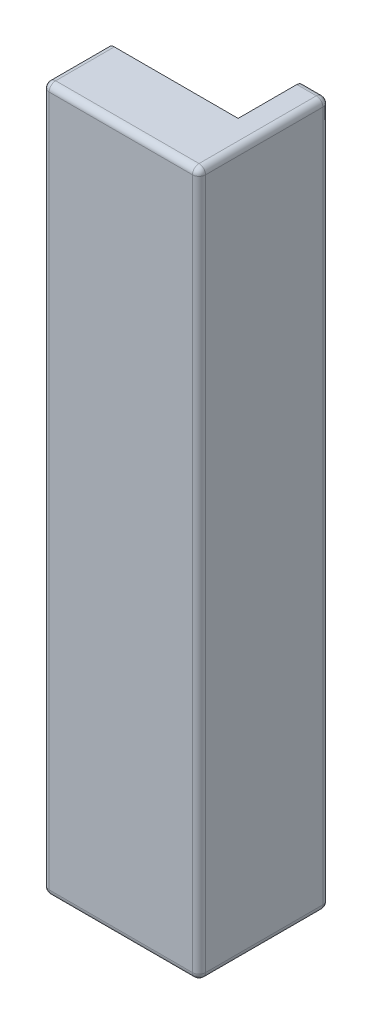
ISO-10303-21;
HEADER;
FILE_DESCRIPTION(('STEP AP214'),'2;1');
FILE_NAME('part.step','',(''),(''),'','','');
FILE_SCHEMA(('AUTOMOTIVE_DESIGN { 1 0 10303 214 1 1 1 1 }'));
ENDSEC;
DATA;
#1=APPLICATION_CONTEXT('core data for automotive mechanical design processes');
#2=APPLICATION_PROTOCOL_DEFINITION('international standard','automotive_design',2000,#1);
#3=PRODUCT_CONTEXT('',#1,'mechanical');
#4=PRODUCT('Part','Part','',(#3));
#5=PRODUCT_RELATED_PRODUCT_CATEGORY('part','',(#4));
#6=PRODUCT_DEFINITION_FORMATION('','',#4);
#7=PRODUCT_DEFINITION_CONTEXT('part definition',#1,'design');
#8=PRODUCT_DEFINITION('design','',#6,#7);
#9=PRODUCT_DEFINITION_SHAPE('','',#8);
#10=(LENGTH_UNIT() NAMED_UNIT(*) SI_UNIT(.MILLI.,.METRE.));
#11=(NAMED_UNIT(*) PLANE_ANGLE_UNIT() SI_UNIT($,.RADIAN.));
#12=(NAMED_UNIT(*) SI_UNIT($,.STERADIAN.) SOLID_ANGLE_UNIT());
#13=UNCERTAINTY_MEASURE_WITH_UNIT(LENGTH_MEASURE(1.E-05),#10,'distance_accuracy_value','');
#14=(GEOMETRIC_REPRESENTATION_CONTEXT(3) GLOBAL_UNCERTAINTY_ASSIGNED_CONTEXT((#13)) GLOBAL_UNIT_ASSIGNED_CONTEXT((#10,
#11,#12)) REPRESENTATION_CONTEXT('',''));
#15=CARTESIAN_POINT('',(0.,0.,0.));
#16=DIRECTION('',(0.,0.,1.));
#17=DIRECTION('',(1.,0.,0.));
#18=AXIS2_PLACEMENT_3D('',#15,#16,#17);
#19=CARTESIAN_POINT('',(-30.8979043428297,-33.1465425171613,10.));
#20=DIRECTION('',(0.,1.,0.));
#21=DIRECTION('',(0.,0.,1.));
#22=AXIS2_PLACEMENT_3D('',#19,#20,#21);
#23=PLANE('',#22);
#24=DIRECTION('',(1.,0.,0.));
#25=VECTOR('',#24,1.);
#26=CARTESIAN_POINT('',(-30.8979043428297,-33.1465425171613,9.5));
#27=LINE('',#26,#25);
#28=CARTESIAN_POINT('',(-19.3979043428297,-33.1465425171613,9.5));
#29=VERTEX_POINT('',#28);
#30=CARTESIAN_POINT('',(-30.3979043428297,-33.1465425171613,9.5));
#31=VERTEX_POINT('',#30);
#32=EDGE_CURVE('E281',#29,#31,#27,.F.);
#33=ORIENTED_EDGE('',*,*,#32,.T.);
#34=DIRECTION('',(0.,0.,-1.));
#35=VECTOR('',#34,1.);
#36=CARTESIAN_POINT('',(-30.3979043428297,-33.1465425171613,10.));
#37=LINE('',#36,#35);
#38=CARTESIAN_POINT('',(-30.3979043428297,-33.1465425171613,5.00000000000001));
#39=VERTEX_POINT('',#38);
#40=EDGE_CURVE('E285',#31,#39,#37,.T.);
#41=ORIENTED_EDGE('',*,*,#40,.T.);
#42=DIRECTION('',(1.,0.,0.));
#43=VECTOR('',#42,1.);
#44=CARTESIAN_POINT('',(-30.8979043428297,-33.1465425171613,5.00000000000001));
#45=LINE('',#44,#43);
#46=CARTESIAN_POINT('',(-20.8979043428297,-33.1465425171613,5.00000000000001));
#47=VERTEX_POINT('',#46);
#48=EDGE_CURVE('E242',#39,#47,#45,.T.);
#49=ORIENTED_EDGE('',*,*,#48,.T.);
#50=DIRECTION('',(0.,0.,-1.));
#51=VECTOR('',#50,1.);
#52=CARTESIAN_POINT('',(-20.8979043428297,-33.1465425171613,10.));
#53=LINE('',#52,#51);
#54=CARTESIAN_POINT('',(-20.8979043428297,-33.1465425171613,0.5));
#55=VERTEX_POINT('',#54);
#56=EDGE_CURVE('E244',#47,#55,#53,.T.);
#57=ORIENTED_EDGE('',*,*,#56,.T.);
#58=DIRECTION('',(1.,0.,0.));
#59=VECTOR('',#58,1.);
#60=CARTESIAN_POINT('',(-18.8979043428297,-33.1465425171613,0.5));
#61=LINE('',#60,#59);
#62=CARTESIAN_POINT('',(-19.3979043428297,-33.1465425171613,0.5));
#63=VERTEX_POINT('',#62);
#64=EDGE_CURVE('E283',#55,#63,#61,.T.);
#65=ORIENTED_EDGE('',*,*,#64,.T.);
#66=DIRECTION('',(0.,0.,-1.));
#67=VECTOR('',#66,1.);
#68=CARTESIAN_POINT('',(-19.3979043428297,-33.1465425171613,10.));
#69=LINE('',#68,#67);
#70=EDGE_CURVE('E279',#63,#29,#69,.F.);
#71=ORIENTED_EDGE('',*,*,#70,.T.);
#72=EDGE_LOOP('',(#33,#41,#49,#57,#65,#71));
#73=FACE_BOUND('',#72,.T.);
#74=ADVANCED_FACE('F43',(#73),#23,.F.);
#75=CARTESIAN_POINT('',(-18.8979043428297,20.8534574828387,10.));
#76=DIRECTION('',(1.,0.,0.));
#77=DIRECTION('',(0.,1.,0.));
#78=AXIS2_PLACEMENT_3D('',#75,#76,#77);
#79=PLANE('',#78);
#80=DIRECTION('',(0.,0.,-1.));
#81=VECTOR('',#80,1.);
#82=CARTESIAN_POINT('',(-18.8979043428297,-32.6465425171613,0.));
#83=LINE('',#82,#81);
#84=CARTESIAN_POINT('',(-18.8979043428297,-32.6465425171613,9.5));
#85=VERTEX_POINT('',#84);
#86=CARTESIAN_POINT('',(-18.8979043428297,-32.6465425171613,0.5));
#87=VERTEX_POINT('',#86);
#88=EDGE_CURVE('E338',#85,#87,#83,.T.);
#89=ORIENTED_EDGE('',*,*,#88,.T.);
#90=DIRECTION('',(0.,-1.,0.));
#91=VECTOR('',#90,1.);
#92=CARTESIAN_POINT('',(-18.8979043428297,20.8534574828387,0.5));
#93=LINE('',#92,#91);
#94=CARTESIAN_POINT('',(-18.8979043428297,20.3534574828387,0.5));
#95=VERTEX_POINT('',#94);
#96=EDGE_CURVE('E341',#87,#95,#93,.F.);
#97=ORIENTED_EDGE('',*,*,#96,.T.);
#98=DIRECTION('',(0.,0.,-1.));
#99=VECTOR('',#98,1.);
#100=CARTESIAN_POINT('',(-18.8979043428297,20.3534574828387,10.));
#101=LINE('',#100,#99);
#102=CARTESIAN_POINT('',(-18.8979043428297,20.3534574828387,9.5));
#103=VERTEX_POINT('',#102);
#104=EDGE_CURVE('E68',#95,#103,#101,.F.);
#105=ORIENTED_EDGE('',*,*,#104,.T.);
#106=DIRECTION('',(0.,-1.,0.));
#107=VECTOR('',#106,1.);
#108=CARTESIAN_POINT('',(-18.8979043428297,-33.1465425171613,9.5));
#109=LINE('',#108,#107);
#110=EDGE_CURVE('E336',#103,#85,#109,.T.);
#111=ORIENTED_EDGE('',*,*,#110,.T.);
#112=EDGE_LOOP('',(#89,#97,#105,#111));
#113=FACE_BOUND('',#112,.T.);
#114=ADVANCED_FACE('F512',(#113),#79,.T.);
#115=CARTESIAN_POINT('',(-30.8979043428297,20.8534574828387,10.));
#116=DIRECTION('',(0.,1.,0.));
#117=DIRECTION('',(0.,0.,1.));
#118=AXIS2_PLACEMENT_3D('',#115,#116,#117);
#119=PLANE('',#118);
#120=DIRECTION('',(1.,0.,0.));
#121=VECTOR('',#120,1.);
#122=CARTESIAN_POINT('',(-30.8979043428297,20.8534574828387,5.));
#123=LINE('',#122,#121);
#124=CARTESIAN_POINT('',(-30.3979043428297,20.8534574828387,5.));
#125=VERTEX_POINT('',#124);
#126=CARTESIAN_POINT('',(-20.8979043428297,20.8534574828387,5.));
#127=VERTEX_POINT('',#126);
#128=EDGE_CURVE('E228',#125,#127,#123,.T.);
#129=ORIENTED_EDGE('',*,*,#128,.F.);
#130=DIRECTION('',(0.,0.,-1.));
#131=VECTOR('',#130,1.);
#132=CARTESIAN_POINT('',(-30.3979043428297,20.8534574828387,10.));
#133=LINE('',#132,#131);
#134=CARTESIAN_POINT('',(-30.3979043428297,20.8534574828387,9.5));
#135=VERTEX_POINT('',#134);
#136=EDGE_CURVE('E314',#125,#135,#133,.F.);
#137=ORIENTED_EDGE('',*,*,#136,.T.);
#138=DIRECTION('',(1.,0.,0.));
#139=VECTOR('',#138,1.);
#140=CARTESIAN_POINT('',(-18.8979043428297,20.8534574828387,9.5));
#141=LINE('',#140,#139);
#142=CARTESIAN_POINT('',(-19.3979043428297,20.8534574828387,9.5));
#143=VERTEX_POINT('',#142);
#144=EDGE_CURVE('E310',#135,#143,#141,.T.);
#145=ORIENTED_EDGE('',*,*,#144,.T.);
#146=DIRECTION('',(0.,0.,-1.));
#147=VECTOR('',#146,1.);
#148=CARTESIAN_POINT('',(-19.3979043428297,20.8534574828387,10.));
#149=LINE('',#148,#147);
#150=CARTESIAN_POINT('',(-19.3979043428297,20.8534574828387,0.5));
#151=VERTEX_POINT('',#150);
#152=EDGE_CURVE('E308',#143,#151,#149,.T.);
#153=ORIENTED_EDGE('',*,*,#152,.T.);
#154=DIRECTION('',(1.,0.,0.));
#155=VECTOR('',#154,1.);
#156=CARTESIAN_POINT('',(-30.8979043428297,20.8534574828387,0.5));
#157=LINE('',#156,#155);
#158=CARTESIAN_POINT('',(-20.8979043428297,20.8534574828387,0.5));
#159=VERTEX_POINT('',#158);
#160=EDGE_CURVE('E312',#151,#159,#157,.F.);
#161=ORIENTED_EDGE('',*,*,#160,.T.);
#162=DIRECTION('',(0.,0.,-1.));
#163=VECTOR('',#162,1.);
#164=CARTESIAN_POINT('',(-20.8979043428297,20.8534574828387,10.));
#165=LINE('',#164,#163);
#166=EDGE_CURVE('E247',#127,#159,#165,.T.);
#167=ORIENTED_EDGE('',*,*,#166,.F.);
#168=EDGE_LOOP('',(#129,#137,#145,#153,#161,#167));
#169=FACE_BOUND('',#168,.T.);
#170=ADVANCED_FACE('F499',(#169),#119,.T.);
#171=CARTESIAN_POINT('',(-30.8979043428297,20.8534574828387,10.));
#172=DIRECTION('',(1.,0.,0.));
#173=DIRECTION('',(0.,1.,0.));
#174=AXIS2_PLACEMENT_3D('',#171,#172,#173);
#175=PLANE('',#174);
#176=DIRECTION('',(0.,1.,0.));
#177=VECTOR('',#176,1.);
#178=CARTESIAN_POINT('',(-30.8979043428297,20.8534574828387,8.5));
#179=LINE('',#178,#177);
#180=CARTESIAN_POINT('',(-30.8979043428297,19.3534574828387,8.5));
#181=VERTEX_POINT('',#180);
#182=CARTESIAN_POINT('',(-30.8979043428297,-31.6465425171613,8.50000000000001));
#183=VERTEX_POINT('',#182);
#184=EDGE_CURVE('E269',#181,#183,#179,.F.);
#185=ORIENTED_EDGE('',*,*,#184,.T.);
#186=DIRECTION('',(0.,0.,1.));
#187=VECTOR('',#186,1.);
#188=CARTESIAN_POINT('',(-30.8979043428297,-31.6465425171613,10.));
#189=LINE('',#188,#187);
#190=CARTESIAN_POINT('',(-30.8979043428297,-31.6465425171613,5.00000000000001));
#191=VERTEX_POINT('',#190);
#192=EDGE_CURVE('E273',#183,#191,#189,.F.);
#193=ORIENTED_EDGE('',*,*,#192,.T.);
#194=DIRECTION('',(0.,1.,0.));
#195=VECTOR('',#194,1.);
#196=CARTESIAN_POINT('',(-30.8979043428297,23.1695625144717,5.));
#197=LINE('',#196,#195);
#198=CARTESIAN_POINT('',(-30.8979043428297,-32.6465425171613,5.00000000000001));
#199=VERTEX_POINT('',#198);
#200=EDGE_CURVE('E234',#199,#191,#197,.T.);
#201=ORIENTED_EDGE('',*,*,#200,.F.);
#202=DIRECTION('',(0.,0.,-1.));
#203=VECTOR('',#202,1.);
#204=CARTESIAN_POINT('',(-30.8979043428297,-32.6465425171613,10.));
#205=LINE('',#204,#203);
#206=CARTESIAN_POINT('',(-30.8979043428297,-32.6465425171613,9.5));
#207=VERTEX_POINT('',#206);
#208=EDGE_CURVE('E267',#199,#207,#205,.F.);
#209=ORIENTED_EDGE('',*,*,#208,.T.);
#210=DIRECTION('',(0.,-1.,0.));
#211=VECTOR('',#210,1.);
#212=CARTESIAN_POINT('',(-30.8979043428297,20.8534574828387,9.5));
#213=LINE('',#212,#211);
#214=CARTESIAN_POINT('',(-30.8979043428297,20.3534574828387,9.5));
#215=VERTEX_POINT('',#214);
#216=EDGE_CURVE('E265',#207,#215,#213,.F.);
#217=ORIENTED_EDGE('',*,*,#216,.T.);
#218=DIRECTION('',(0.,0.,-1.));
#219=VECTOR('',#218,1.);
#220=CARTESIAN_POINT('',(-30.8979043428297,20.3534574828387,5.));
#221=LINE('',#220,#219);
#222=CARTESIAN_POINT('',(-30.8979043428297,20.3534574828387,5.));
#223=VERTEX_POINT('',#222);
#224=EDGE_CURVE('E263',#215,#223,#221,.T.);
#225=ORIENTED_EDGE('',*,*,#224,.T.);
#226=CARTESIAN_POINT('',(-30.8979043428297,19.3534574828387,5.));
#227=VERTEX_POINT('',#226);
#228=EDGE_CURVE('E237',#227,#223,#197,.T.);
#229=ORIENTED_EDGE('',*,*,#228,.F.);
#230=DIRECTION('',(0.,0.,-1.));
#231=VECTOR('',#230,1.);
#232=CARTESIAN_POINT('',(-30.8979043428297,19.3534574828387,10.));
#233=LINE('',#232,#231);
#234=EDGE_CURVE('E271',#227,#181,#233,.F.);
#235=ORIENTED_EDGE('',*,*,#234,.T.);
#236=EDGE_LOOP('',(#185,#193,#201,#209,#217,#225,#229,#235));
#237=FACE_BOUND('',#236,.T.);
#238=ADVANCED_FACE('F454',(#237),#175,.F.);
#239=CARTESIAN_POINT('',(0.,0.,10.));
#240=DIRECTION('',(0.,0.,-1.));
#241=DIRECTION('',(-1.,0.,0.));
#242=AXIS2_PLACEMENT_3D('',#239,#240,#241);
#243=PLANE('',#242);
#244=DIRECTION('',(1.,0.,0.));
#245=VECTOR('',#244,1.);
#246=CARTESIAN_POINT('',(-30.8979043428297,20.3534574828387,10.));
#247=LINE('',#246,#245);
#248=CARTESIAN_POINT('',(-19.3979043428297,20.3534574828387,10.));
#249=VERTEX_POINT('',#248);
#250=CARTESIAN_POINT('',(-30.3979043428297,20.3534574828387,10.));
#251=VERTEX_POINT('',#250);
#252=EDGE_CURVE('E303',#249,#251,#247,.F.);
#253=ORIENTED_EDGE('',*,*,#252,.T.);
#254=DIRECTION('',(0.,-1.,0.));
#255=VECTOR('',#254,1.);
#256=CARTESIAN_POINT('',(-30.3979043428297,0.,10.));
#257=LINE('',#256,#255);
#258=CARTESIAN_POINT('',(-30.3979043428297,-32.6465425171613,10.));
#259=VERTEX_POINT('',#258);
#260=EDGE_CURVE('E305',#251,#259,#257,.T.);
#261=ORIENTED_EDGE('',*,*,#260,.T.);
#262=DIRECTION('',(1.,0.,0.));
#263=VECTOR('',#262,1.);
#264=CARTESIAN_POINT('',(0.,-32.6465425171613,10.));
#265=LINE('',#264,#263);
#266=CARTESIAN_POINT('',(-19.3979043428297,-32.6465425171613,10.));
#267=VERTEX_POINT('',#266);
#268=EDGE_CURVE('E301',#259,#267,#265,.T.);
#269=ORIENTED_EDGE('',*,*,#268,.T.);
#270=DIRECTION('',(0.,-1.,0.));
#271=VECTOR('',#270,1.);
#272=CARTESIAN_POINT('',(-19.3979043428297,20.8534574828387,10.));
#273=LINE('',#272,#271);
#274=EDGE_CURVE('E299',#267,#249,#273,.F.);
#275=ORIENTED_EDGE('',*,*,#274,.T.);
#276=EDGE_LOOP('',(#253,#261,#269,#275));
#277=FACE_BOUND('',#276,.T.);
#278=ADVANCED_FACE('F800',(#277),#243,.F.);
#279=CARTESIAN_POINT('',(0.,0.,0.));
#280=DIRECTION('',(0.,0.,-1.));
#281=DIRECTION('',(-1.,0.,0.));
#282=AXIS2_PLACEMENT_3D('',#279,#280,#281);
#283=PLANE('',#282);
#284=DIRECTION('',(0.,-1.,0.));
#285=VECTOR('',#284,1.);
#286=CARTESIAN_POINT('',(-20.8979043428297,18.8534574828387,0.));
#287=LINE('',#286,#285);
#288=CARTESIAN_POINT('',(-20.8979043428297,20.3534574828387,0.));
#289=VERTEX_POINT('',#288);
#290=CARTESIAN_POINT('',(-20.8979043428297,-32.6465425171613,0.));
#291=VERTEX_POINT('',#290);
#292=EDGE_CURVE('E249',#289,#291,#287,.T.);
#293=ORIENTED_EDGE('',*,*,#292,.F.);
#294=DIRECTION('',(1.,0.,0.));
#295=VECTOR('',#294,1.);
#296=CARTESIAN_POINT('',(0.,20.3534574828387,0.));
#297=LINE('',#296,#295);
#298=CARTESIAN_POINT('',(-19.3979043428297,20.3534574828387,0.));
#299=VERTEX_POINT('',#298);
#300=EDGE_CURVE('E334',#289,#299,#297,.T.);
#301=ORIENTED_EDGE('',*,*,#300,.T.);
#302=DIRECTION('',(0.,-1.,0.));
#303=VECTOR('',#302,1.);
#304=CARTESIAN_POINT('',(-19.3979043428297,0.,0.));
#305=LINE('',#304,#303);
#306=CARTESIAN_POINT('',(-19.3979043428297,-32.6465425171613,0.));
#307=VERTEX_POINT('',#306);
#308=EDGE_CURVE('E330',#299,#307,#305,.T.);
#309=ORIENTED_EDGE('',*,*,#308,.T.);
#310=DIRECTION('',(1.,0.,0.));
#311=VECTOR('',#310,1.);
#312=CARTESIAN_POINT('',(-20.8979043428297,-32.6465425171613,0.));
#313=LINE('',#312,#311);
#314=EDGE_CURVE('E332',#307,#291,#313,.F.);
#315=ORIENTED_EDGE('',*,*,#314,.T.);
#316=EDGE_LOOP('',(#293,#301,#309,#315));
#317=FACE_BOUND('',#316,.T.);
#318=ADVANCED_FACE('F536',(#317),#283,.T.);
#319=CARTESIAN_POINT('',(-20.8979043428297,18.8534574828387,0.));
#320=DIRECTION('',(0.,1.,0.));
#321=DIRECTION('',(0.,0.,1.));
#322=AXIS2_PLACEMENT_3D('',#319,#320,#321);
#323=PLANE('',#322);
#324=DIRECTION('',(-1.,0.,0.));
#325=VECTOR('',#324,1.);
#326=CARTESIAN_POINT('',(-20.8979043428297,18.8534574828387,8.));
#327=LINE('',#326,#325);
#328=CARTESIAN_POINT('',(-20.3979043428297,18.8534574828387,8.));
#329=VERTEX_POINT('',#328);
#330=CARTESIAN_POINT('',(-30.3979043428297,18.8534574828387,8.));
#331=VERTEX_POINT('',#330);
#332=EDGE_CURVE('E253',#329,#331,#327,.T.);
#333=ORIENTED_EDGE('',*,*,#332,.T.);
#334=DIRECTION('',(0.,0.,-1.));
#335=VECTOR('',#334,1.);
#336=CARTESIAN_POINT('',(-30.3979043428297,18.8534574828387,0.));
#337=LINE('',#336,#335);
#338=CARTESIAN_POINT('',(-30.3979043428297,18.8534574828387,5.));
#339=VERTEX_POINT('',#338);
#340=EDGE_CURVE('E225',#331,#339,#337,.T.);
#341=ORIENTED_EDGE('',*,*,#340,.T.);
#342=DIRECTION('',(1.,0.,0.));
#343=VECTOR('',#342,1.);
#344=CARTESIAN_POINT('',(-20.8979043428297,18.8534574828387,5.));
#345=LINE('',#344,#343);
#346=CARTESIAN_POINT('',(-20.8979043428297,18.8534574828387,5.));
#347=VERTEX_POINT('',#346);
#348=EDGE_CURVE('E221',#339,#347,#345,.T.);
#349=ORIENTED_EDGE('',*,*,#348,.T.);
#350=DIRECTION('',(0.,0.,1.));
#351=VECTOR('',#350,1.);
#352=CARTESIAN_POINT('',(-20.8979043428297,18.8534574828387,0.));
#353=LINE('',#352,#351);
#354=CARTESIAN_POINT('',(-20.8979043428297,18.8534574828387,4.5));
#355=VERTEX_POINT('',#354);
#356=EDGE_CURVE('E207',#355,#347,#353,.T.);
#357=ORIENTED_EDGE('',*,*,#356,.F.);
#358=CARTESIAN_POINT('',(-20.3979043428297,18.8534574828387,4.5));
#359=DIRECTION('',(0.,1.,0.));
#360=DIRECTION('',(0.,0.,1.));
#361=AXIS2_PLACEMENT_3D('',#358,#359,#360);
#362=CIRCLE('',#361,0.5);
#363=CARTESIAN_POINT('',(-20.3979043428297,18.8534574828387,5.));
#364=VERTEX_POINT('',#363);
#365=EDGE_CURVE('E11',#355,#364,#362,.T.);
#366=ORIENTED_EDGE('',*,*,#365,.T.);
#367=DIRECTION('',(0.,0.,-1.));
#368=VECTOR('',#367,1.);
#369=CARTESIAN_POINT('',(-20.3979043428297,18.8534574828387,8.));
#370=LINE('',#369,#368);
#371=EDGE_CURVE('E288',#364,#329,#370,.F.);
#372=ORIENTED_EDGE('',*,*,#371,.T.);
#373=EDGE_LOOP('',(#333,#341,#349,#357,#366,#372));
#374=FACE_BOUND('',#373,.T.);
#375=ADVANCED_FACE('F223',(#374),#323,.F.);
#376=CARTESIAN_POINT('',(-20.8979043428297,18.8534574828387,8.));
#377=DIRECTION('',(0.,0.,1.));
#378=DIRECTION('',(0.,-1.,0.));
#379=AXIS2_PLACEMENT_3D('',#376,#377,#378);
#380=PLANE('',#379);
#381=DIRECTION('',(-1.,0.,0.));
#382=VECTOR('',#381,1.);
#383=CARTESIAN_POINT('',(-20.8979043428297,-31.1465425171613,8.00000000000001));
#384=LINE('',#383,#382);
#385=CARTESIAN_POINT('',(-20.3979043428297,-31.1465425171613,8.00000000000001));
#386=VERTEX_POINT('',#385);
#387=CARTESIAN_POINT('',(-30.3979043428297,-31.1465425171613,8.00000000000001));
#388=VERTEX_POINT('',#387);
#389=EDGE_CURVE('E252',#386,#388,#384,.T.);
#390=ORIENTED_EDGE('',*,*,#389,.T.);
#391=DIRECTION('',(0.,1.,0.));
#392=VECTOR('',#391,1.);
#393=CARTESIAN_POINT('',(-30.3979043428297,18.8534574828387,8.));
#394=LINE('',#393,#392);
#395=EDGE_CURVE('E297',#388,#331,#394,.T.);
#396=ORIENTED_EDGE('',*,*,#395,.T.);
#397=ORIENTED_EDGE('',*,*,#332,.F.);
#398=DIRECTION('',(0.,1.,0.));
#399=VECTOR('',#398,1.);
#400=CARTESIAN_POINT('',(-20.3979043428297,-31.1465425171613,8.00000000000001));
#401=LINE('',#400,#399);
#402=EDGE_CURVE('E295',#329,#386,#401,.F.);
#403=ORIENTED_EDGE('',*,*,#402,.T.);
#404=EDGE_LOOP('',(#390,#396,#397,#403));
#405=FACE_BOUND('',#404,.T.);
#406=ADVANCED_FACE('F439',(#405),#380,.F.);
#407=CARTESIAN_POINT('',(-20.8979043428297,-31.1465425171613,0.));
#408=DIRECTION('',(0.,-1.,0.));
#409=DIRECTION('',(0.,0.,-1.));
#410=AXIS2_PLACEMENT_3D('',#407,#408,#409);
#411=PLANE('',#410);
#412=DIRECTION('',(-1.,0.,0.));
#413=VECTOR('',#412,1.);
#414=CARTESIAN_POINT('',(-20.8979043428297,-31.1465425171613,5.00000000000001));
#415=LINE('',#414,#413);
#416=CARTESIAN_POINT('',(-20.8979043428297,-31.1465425171613,5.));
#417=VERTEX_POINT('',#416);
#418=CARTESIAN_POINT('',(-30.3979043428297,-31.1465425171613,5.00000000000001));
#419=VERTEX_POINT('',#418);
#420=EDGE_CURVE('E229',#417,#419,#415,.T.);
#421=ORIENTED_EDGE('',*,*,#420,.T.);
#422=DIRECTION('',(0.,0.,1.));
#423=VECTOR('',#422,1.);
#424=CARTESIAN_POINT('',(-30.3979043428297,-31.1465425171613,0.));
#425=LINE('',#424,#423);
#426=EDGE_CURVE('E260',#419,#388,#425,.T.);
#427=ORIENTED_EDGE('',*,*,#426,.T.);
#428=ORIENTED_EDGE('',*,*,#389,.F.);
#429=DIRECTION('',(0.,0.,1.));
#430=VECTOR('',#429,1.);
#431=CARTESIAN_POINT('',(-20.3979043428297,-31.1465425171613,5.));
#432=LINE('',#431,#430);
#433=CARTESIAN_POINT('',(-20.3979043428297,-31.1465425171613,5.));
#434=VERTEX_POINT('',#433);
#435=EDGE_CURVE('E255',#386,#434,#432,.F.);
#436=ORIENTED_EDGE('',*,*,#435,.T.);
#437=CARTESIAN_POINT('',(-20.3979043428297,-31.1465425171613,4.5));
#438=DIRECTION('',(0.,-1.,0.));
#439=DIRECTION('',(0.,0.,-1.));
#440=AXIS2_PLACEMENT_3D('',#437,#438,#439);
#441=CIRCLE('',#440,0.5);
#442=CARTESIAN_POINT('',(-20.8979043428297,-31.1465425171613,4.5));
#443=VERTEX_POINT('',#442);
#444=EDGE_CURVE('E52',#434,#443,#441,.T.);
#445=ORIENTED_EDGE('',*,*,#444,.T.);
#446=DIRECTION('',(0.,0.,-1.));
#447=VECTOR('',#446,1.);
#448=CARTESIAN_POINT('',(-20.8979043428297,-31.1465425171613,0.));
#449=LINE('',#448,#447);
#450=EDGE_CURVE('E60',#417,#443,#449,.T.);
#451=ORIENTED_EDGE('',*,*,#450,.F.);
#452=EDGE_LOOP('',(#421,#427,#428,#436,#445,#451));
#453=FACE_BOUND('',#452,.T.);
#454=ADVANCED_FACE('F422',(#453),#411,.F.);
#455=CARTESIAN_POINT('',(-20.8979043428297,0.,0.));
#456=DIRECTION('',(-1.,0.,0.));
#457=DIRECTION('',(0.,0.,1.));
#458=AXIS2_PLACEMENT_3D('',#455,#456,#457);
#459=PLANE('',#458);
#460=DIRECTION('',(0.,1.,0.));
#461=VECTOR('',#460,1.);
#462=CARTESIAN_POINT('',(-20.8979043428297,23.1695625144717,5.));
#463=LINE('',#462,#461);
#464=EDGE_CURVE('E233',#47,#417,#463,.T.);
#465=ORIENTED_EDGE('',*,*,#464,.T.);
#466=ORIENTED_EDGE('',*,*,#450,.T.);
#467=DIRECTION('',(0.,-1.,0.));
#468=VECTOR('',#467,1.);
#469=CARTESIAN_POINT('',(-20.8979043428297,18.8534574828387,4.5));
#470=LINE('',#469,#468);
#471=EDGE_CURVE('E215',#443,#355,#470,.F.);
#472=ORIENTED_EDGE('',*,*,#471,.T.);
#473=ORIENTED_EDGE('',*,*,#356,.T.);
#474=EDGE_CURVE('E212',#347,#127,#463,.T.);
#475=ORIENTED_EDGE('',*,*,#474,.T.);
#476=ORIENTED_EDGE('',*,*,#166,.T.);
#477=CARTESIAN_POINT('',(-20.8979043428297,20.3534574828387,0.5));
#478=DIRECTION('',(-1.,0.,0.));
#479=DIRECTION('',(0.,0.,1.));
#480=AXIS2_PLACEMENT_3D('',#477,#478,#479);
#481=CIRCLE('',#480,0.5);
#482=EDGE_CURVE('E218',#159,#289,#481,.T.);
#483=ORIENTED_EDGE('',*,*,#482,.T.);
#484=ORIENTED_EDGE('',*,*,#292,.T.);
#485=CARTESIAN_POINT('',(-20.8979043428297,-32.6465425171613,0.5));
#486=DIRECTION('',(-1.,0.,0.));
#487=DIRECTION('',(0.,0.,1.));
#488=AXIS2_PLACEMENT_3D('',#485,#486,#487);
#489=CIRCLE('',#488,0.5);
#490=EDGE_CURVE('E325',#291,#55,#489,.T.);
#491=ORIENTED_EDGE('',*,*,#490,.T.);
#492=ORIENTED_EDGE('',*,*,#56,.F.);
#493=EDGE_LOOP('',(#465,#466,#472,#473,#475,#476,#483,#484,#491,#492));
#494=FACE_BOUND('',#493,.T.);
#495=ADVANCED_FACE('F209',(#494),#459,.T.);
#496=CARTESIAN_POINT('',(-20.8979043428297,23.1695625144717,5.));
#497=DIRECTION('',(0.,0.,1.));
#498=DIRECTION('',(0.,-1.,0.));
#499=AXIS2_PLACEMENT_3D('',#496,#497,#498);
#500=PLANE('',#499);
#501=ORIENTED_EDGE('',*,*,#200,.T.);
#502=CARTESIAN_POINT('',(-30.3979043428297,-31.6465425171613,5.00000000000001));
#503=DIRECTION('',(0.,0.,1.));
#504=DIRECTION('',(0.,-1.,0.));
#505=AXIS2_PLACEMENT_3D('',#502,#503,#504);
#506=CIRCLE('',#505,0.5);
#507=EDGE_CURVE('E277',#191,#419,#506,.F.);
#508=ORIENTED_EDGE('',*,*,#507,.T.);
#509=ORIENTED_EDGE('',*,*,#420,.F.);
#510=ORIENTED_EDGE('',*,*,#464,.F.);
#511=ORIENTED_EDGE('',*,*,#48,.F.);
#512=CARTESIAN_POINT('',(-30.3979043428297,-32.6465425171613,5.00000000000001));
#513=DIRECTION('',(0.,0.,1.));
#514=DIRECTION('',(0.,-1.,0.));
#515=AXIS2_PLACEMENT_3D('',#512,#513,#514);
#516=CIRCLE('',#515,0.5);
#517=EDGE_CURVE('E275',#39,#199,#516,.F.);
#518=ORIENTED_EDGE('',*,*,#517,.T.);
#519=EDGE_LOOP('',(#501,#508,#509,#510,#511,#518));
#520=FACE_BOUND('',#519,.T.);
#521=ADVANCED_FACE('F457',(#520),#500,.F.);
#522=ORIENTED_EDGE('',*,*,#348,.F.);
#523=CARTESIAN_POINT('',(-30.3979043428297,19.3534574828387,5.));
#524=DIRECTION('',(0.,0.,1.));
#525=DIRECTION('',(0.,-1.,0.));
#526=AXIS2_PLACEMENT_3D('',#523,#524,#525);
#527=CIRCLE('',#526,0.5);
#528=EDGE_CURVE('E293',#339,#227,#527,.F.);
#529=ORIENTED_EDGE('',*,*,#528,.T.);
#530=ORIENTED_EDGE('',*,*,#228,.T.);
#531=CARTESIAN_POINT('',(-30.3979043428297,20.3534574828387,5.));
#532=DIRECTION('',(0.,0.,1.));
#533=DIRECTION('',(0.,-1.,0.));
#534=AXIS2_PLACEMENT_3D('',#531,#532,#533);
#535=CIRCLE('',#534,0.5);
#536=EDGE_CURVE('E291',#223,#125,#535,.F.);
#537=ORIENTED_EDGE('',*,*,#536,.T.);
#538=ORIENTED_EDGE('',*,*,#128,.T.);
#539=ORIENTED_EDGE('',*,*,#474,.F.);
#540=EDGE_LOOP('',(#522,#529,#530,#537,#538,#539));
#541=FACE_BOUND('',#540,.T.);
#542=ADVANCED_FACE('F231',(#541),#500,.F.);
#543=CARTESIAN_POINT('',(-19.8979043428297,0.,0.));
#544=DIRECTION('',(1.,0.,0.));
#545=DIRECTION('',(0.,0.,-1.));
#546=AXIS2_PLACEMENT_3D('',#543,#544,#545);
#547=PLANE('',#546);
#548=DIRECTION('',(0.,0.,-1.));
#549=VECTOR('',#548,1.);
#550=CARTESIAN_POINT('',(-19.8979043428297,18.3534574828387,5.));
#551=LINE('',#550,#549);
#552=CARTESIAN_POINT('',(-19.8979043428297,18.3534574828387,7.5));
#553=VERTEX_POINT('',#552);
#554=CARTESIAN_POINT('',(-19.8979043428297,18.3534574828387,5.5));
#555=VERTEX_POINT('',#554);
#556=EDGE_CURVE('E318',#553,#555,#551,.T.);
#557=ORIENTED_EDGE('',*,*,#556,.T.);
#558=DIRECTION('',(0.,-1.,0.));
#559=VECTOR('',#558,1.);
#560=CARTESIAN_POINT('',(-19.8979043428297,-31.1465425171613,5.5));
#561=LINE('',#560,#559);
#562=CARTESIAN_POINT('',(-19.8979043428297,-30.6465425171613,5.5));
#563=VERTEX_POINT('',#562);
#564=EDGE_CURVE('E323',#555,#563,#561,.T.);
#565=ORIENTED_EDGE('',*,*,#564,.T.);
#566=DIRECTION('',(0.,0.,1.));
#567=VECTOR('',#566,1.);
#568=CARTESIAN_POINT('',(-19.8979043428297,-30.6465425171613,8.));
#569=LINE('',#568,#567);
#570=CARTESIAN_POINT('',(-19.8979043428297,-30.6465425171613,7.50000000000001));
#571=VERTEX_POINT('',#570);
#572=EDGE_CURVE('E320',#563,#571,#569,.T.);
#573=ORIENTED_EDGE('',*,*,#572,.T.);
#574=DIRECTION('',(0.,1.,0.));
#575=VECTOR('',#574,1.);
#576=CARTESIAN_POINT('',(-19.8979043428297,18.8534574828387,7.5));
#577=LINE('',#576,#575);
#578=EDGE_CURVE('E316',#571,#553,#577,.T.);
#579=ORIENTED_EDGE('',*,*,#578,.T.);
#580=EDGE_LOOP('',(#557,#565,#573,#579));
#581=FACE_BOUND('',#580,.T.);
#582=ADVANCED_FACE('F433',(#581),#547,.F.);
#583=CARTESIAN_POINT('',(-30.3979043428297,19.3534574828387,0.));
#584=DIRECTION('',(0.,0.,-1.));
#585=DIRECTION('',(-1.,0.,0.));
#586=AXIS2_PLACEMENT_3D('',#583,#584,#585);
#587=CYLINDRICAL_SURFACE('',#586,0.5);
#588=ORIENTED_EDGE('',*,*,#528,.F.);
#589=ORIENTED_EDGE('',*,*,#340,.F.);
#590=CARTESIAN_POINT('',(-30.3979043428297,19.3534574828387,8.5));
#591=DIRECTION('',(0.,0.707106781186547,-0.707106781186547));
#592=DIRECTION('',(0.,-0.707106781186548,-0.707106781186547));
#593=AXIS2_PLACEMENT_3D('',#590,#591,#592);
#594=ELLIPSE('',#593,0.707106781186547,0.5);
#595=EDGE_CURVE('E347',#181,#331,#594,.F.);
#596=ORIENTED_EDGE('',*,*,#595,.F.);
#597=ORIENTED_EDGE('',*,*,#234,.F.);
#598=EDGE_LOOP('',(#588,#589,#596,#597));
#599=FACE_BOUND('',#598,.T.);
#600=ADVANCED_FACE('F561',(#599),#587,.T.);
#601=CARTESIAN_POINT('',(-30.3979043428297,18.8534574828387,8.5));
#602=DIRECTION('',(0.,1.,0.));
#603=DIRECTION('',(-1.,0.,0.));
#604=AXIS2_PLACEMENT_3D('',#601,#602,#603);
#605=CYLINDRICAL_SURFACE('',#604,0.5);
#606=ORIENTED_EDGE('',*,*,#595,.T.);
#607=ORIENTED_EDGE('',*,*,#395,.F.);
#608=CARTESIAN_POINT('',(-30.3979043428297,-31.6465425171613,8.50000000000001));
#609=DIRECTION('',(0.,0.707106781186548,0.707106781186547));
#610=DIRECTION('',(0.,-0.707106781186547,0.707106781186547));
#611=AXIS2_PLACEMENT_3D('',#608,#609,#610);
#612=ELLIPSE('',#611,0.707106781186548,0.5);
#613=EDGE_CURVE('E345',#183,#388,#612,.F.);
#614=ORIENTED_EDGE('',*,*,#613,.F.);
#615=ORIENTED_EDGE('',*,*,#184,.F.);
#616=EDGE_LOOP('',(#606,#607,#614,#615));
#617=FACE_BOUND('',#616,.T.);
#618=ADVANCED_FACE('F443',(#617),#605,.T.);
#619=CARTESIAN_POINT('',(-30.3979043428297,-31.6465425171613,0.));
#620=DIRECTION('',(0.,0.,1.));
#621=DIRECTION('',(1.,0.,0.));
#622=AXIS2_PLACEMENT_3D('',#619,#620,#621);
#623=CYLINDRICAL_SURFACE('',#622,0.5);
#624=ORIENTED_EDGE('',*,*,#507,.F.);
#625=ORIENTED_EDGE('',*,*,#192,.F.);
#626=ORIENTED_EDGE('',*,*,#613,.T.);
#627=ORIENTED_EDGE('',*,*,#426,.F.);
#628=EDGE_LOOP('',(#624,#625,#626,#627));
#629=FACE_BOUND('',#628,.T.);
#630=ADVANCED_FACE('F450',(#629),#623,.T.);
#631=CARTESIAN_POINT('',(0.,20.3534574828387,0.5));
#632=DIRECTION('',(1.,0.,0.));
#633=DIRECTION('',(0.,0.,-1.));
#634=AXIS2_PLACEMENT_3D('',#631,#632,#633);
#635=CYLINDRICAL_SURFACE('',#634,0.5);
#636=CARTESIAN_POINT('',(-19.3979043428297,20.3534574828387,0.5));
#637=DIRECTION('',(1.,0.,0.));
#638=DIRECTION('',(0.,0.,-1.));
#639=AXIS2_PLACEMENT_3D('',#636,#637,#638);
#640=CIRCLE('',#639,0.5);
#641=EDGE_CURVE('E348',#299,#151,#640,.T.);
#642=ORIENTED_EDGE('',*,*,#641,.F.);
#643=ORIENTED_EDGE('',*,*,#300,.F.);
#644=ORIENTED_EDGE('',*,*,#482,.F.);
#645=ORIENTED_EDGE('',*,*,#160,.F.);
#646=EDGE_LOOP('',(#642,#643,#644,#645));
#647=FACE_BOUND('',#646,.T.);
#648=ADVANCED_FACE('F531',(#647),#635,.T.);
#649=CARTESIAN_POINT('',(-19.3979043428297,20.3534574828387,0.5));
#650=DIRECTION('',(0.,1.,0.));
#651=DIRECTION('',(0.,0.,1.));
#652=AXIS2_PLACEMENT_3D('',#649,#650,#651);
#653=SPHERICAL_SURFACE('',#652,0.5);
#654=CARTESIAN_POINT('',(-19.3979043428297,20.3534574828387,0.5));
#655=DIRECTION('',(0.,1.,0.));
#656=DIRECTION('',(0.,0.,1.));
#657=AXIS2_PLACEMENT_3D('',#654,#655,#656);
#658=CIRCLE('',#657,0.5);
#659=EDGE_CURVE('E395',#299,#95,#658,.F.);
#660=ORIENTED_EDGE('',*,*,#659,.F.);
#661=ORIENTED_EDGE('',*,*,#641,.T.);
#662=CARTESIAN_POINT('',(-19.3979043428297,20.3534574828387,0.5));
#663=DIRECTION('',(0.,0.,-1.));
#664=DIRECTION('',(-1.,0.,0.));
#665=AXIS2_PLACEMENT_3D('',#662,#663,#664);
#666=CIRCLE('',#665,0.5);
#667=EDGE_CURVE('E398',#95,#151,#666,.F.);
#668=ORIENTED_EDGE('',*,*,#667,.F.);
#669=EDGE_LOOP('',(#660,#661,#668));
#670=FACE_BOUND('',#669,.T.);
#671=ADVANCED_FACE('F527',(#670),#653,.T.);
#672=CARTESIAN_POINT('',(-19.3979043428297,20.3534574828387,10.));
#673=DIRECTION('',(0.,0.,-1.));
#674=DIRECTION('',(-1.,0.,0.));
#675=AXIS2_PLACEMENT_3D('',#672,#673,#674);
#676=CYLINDRICAL_SURFACE('',#675,0.5);
#677=ORIENTED_EDGE('',*,*,#667,.T.);
#678=ORIENTED_EDGE('',*,*,#152,.F.);
#679=CARTESIAN_POINT('',(-19.3979043428297,20.3534574828387,9.5));
#680=DIRECTION('',(0.,0.,1.));
#681=DIRECTION('',(1.,0.,0.));
#682=AXIS2_PLACEMENT_3D('',#679,#680,#681);
#683=CIRCLE('',#682,0.5);
#684=EDGE_CURVE('E392',#103,#143,#683,.T.);
#685=ORIENTED_EDGE('',*,*,#684,.F.);
#686=ORIENTED_EDGE('',*,*,#104,.F.);
#687=EDGE_LOOP('',(#677,#678,#685,#686));
#688=FACE_BOUND('',#687,.T.);
#689=ADVANCED_FACE('F501',(#688),#676,.T.);
#690=CARTESIAN_POINT('',(-19.3979043428297,0.,0.5));
#691=DIRECTION('',(0.,-1.,0.));
#692=DIRECTION('',(1.,0.,0.));
#693=AXIS2_PLACEMENT_3D('',#690,#691,#692);
#694=CYLINDRICAL_SURFACE('',#693,0.5);
#695=ORIENTED_EDGE('',*,*,#659,.T.);
#696=ORIENTED_EDGE('',*,*,#96,.F.);
#697=CARTESIAN_POINT('',(-19.3979043428297,-32.6465425171613,0.5));
#698=DIRECTION('',(0.,-1.,0.));
#699=DIRECTION('',(0.,0.,-1.));
#700=AXIS2_PLACEMENT_3D('',#697,#698,#699);
#701=CIRCLE('',#700,0.5);
#702=EDGE_CURVE('E389',#307,#87,#701,.T.);
#703=ORIENTED_EDGE('',*,*,#702,.F.);
#704=ORIENTED_EDGE('',*,*,#308,.F.);
#705=EDGE_LOOP('',(#695,#696,#703,#704));
#706=FACE_BOUND('',#705,.T.);
#707=ADVANCED_FACE('F524',(#706),#694,.T.);
#708=CARTESIAN_POINT('',(-30.8979043428297,-32.6465425171613,0.5));
#709=DIRECTION('',(-1.,0.,0.));
#710=DIRECTION('',(0.,0.,1.));
#711=AXIS2_PLACEMENT_3D('',#708,#709,#710);
#712=CYLINDRICAL_SURFACE('',#711,0.5);
#713=ORIENTED_EDGE('',*,*,#490,.F.);
#714=ORIENTED_EDGE('',*,*,#314,.F.);
#715=CARTESIAN_POINT('',(-19.3979043428297,-32.6465425171613,0.5));
#716=DIRECTION('',(1.,0.,0.));
#717=DIRECTION('',(0.,0.,-1.));
#718=AXIS2_PLACEMENT_3D('',#715,#716,#717);
#719=CIRCLE('',#718,0.5);
#720=EDGE_CURVE('E386',#63,#307,#719,.T.);
#721=ORIENTED_EDGE('',*,*,#720,.F.);
#722=ORIENTED_EDGE('',*,*,#64,.F.);
#723=EDGE_LOOP('',(#713,#714,#721,#722));
#724=FACE_BOUND('',#723,.T.);
#725=ADVANCED_FACE('F539',(#724),#712,.T.);
#726=CARTESIAN_POINT('',(-19.3979043428297,20.3534574828387,9.5));
#727=DIRECTION('',(0.,1.,0.));
#728=DIRECTION('',(0.,0.,1.));
#729=AXIS2_PLACEMENT_3D('',#726,#727,#728);
#730=SPHERICAL_SURFACE('',#729,0.5);
#731=CARTESIAN_POINT('',(-19.3979043428297,20.3534574828387,9.5));
#732=DIRECTION('',(0.,1.,0.));
#733=DIRECTION('',(0.,0.,1.));
#734=AXIS2_PLACEMENT_3D('',#731,#732,#733);
#735=CIRCLE('',#734,0.5);
#736=EDGE_CURVE('E380',#103,#249,#735,.F.);
#737=ORIENTED_EDGE('',*,*,#736,.F.);
#738=ORIENTED_EDGE('',*,*,#684,.T.);
#739=CARTESIAN_POINT('',(-19.3979043428297,20.3534574828387,9.5));
#740=DIRECTION('',(1.,0.,0.));
#741=DIRECTION('',(0.,0.,-1.));
#742=AXIS2_PLACEMENT_3D('',#739,#740,#741);
#743=CIRCLE('',#742,0.5);
#744=EDGE_CURVE('E383',#249,#143,#743,.F.);
#745=ORIENTED_EDGE('',*,*,#744,.F.);
#746=EDGE_LOOP('',(#737,#738,#745));
#747=FACE_BOUND('',#746,.T.);
#748=ADVANCED_FACE('F504',(#747),#730,.T.);
#749=CARTESIAN_POINT('',(-19.3979043428297,-32.6465425171613,0.5));
#750=DIRECTION('',(0.,0.,-1.));
#751=DIRECTION('',(-1.,0.,0.));
#752=AXIS2_PLACEMENT_3D('',#749,#750,#751);
#753=SPHERICAL_SURFACE('',#752,0.5);
#754=ORIENTED_EDGE('',*,*,#720,.T.);
#755=ORIENTED_EDGE('',*,*,#702,.T.);
#756=CARTESIAN_POINT('',(-19.3979043428297,-32.6465425171613,0.5));
#757=DIRECTION('',(0.,0.,-1.));
#758=DIRECTION('',(0.,1.,0.));
#759=AXIS2_PLACEMENT_3D('',#756,#757,#758);
#760=CIRCLE('',#759,0.5);
#761=EDGE_CURVE('E377',#63,#87,#760,.F.);
#762=ORIENTED_EDGE('',*,*,#761,.F.);
#763=EDGE_LOOP('',(#754,#755,#762));
#764=FACE_BOUND('',#763,.T.);
#765=ADVANCED_FACE('F519',(#764),#753,.T.);
#766=CARTESIAN_POINT('',(-30.3979043428297,20.3534574828387,10.));
#767=DIRECTION('',(0.,0.,1.));
#768=DIRECTION('',(1.,0.,0.));
#769=AXIS2_PLACEMENT_3D('',#766,#767,#768);
#770=CYLINDRICAL_SURFACE('',#769,0.5);
#771=ORIENTED_EDGE('',*,*,#536,.F.);
#772=ORIENTED_EDGE('',*,*,#224,.F.);
#773=CARTESIAN_POINT('',(-30.3979043428297,20.3534574828387,9.5));
#774=DIRECTION('',(0.,0.,1.));
#775=DIRECTION('',(1.,0.,0.));
#776=AXIS2_PLACEMENT_3D('',#773,#774,#775);
#777=CIRCLE('',#776,0.5);
#778=EDGE_CURVE('E374',#135,#215,#777,.T.);
#779=ORIENTED_EDGE('',*,*,#778,.F.);
#780=ORIENTED_EDGE('',*,*,#136,.F.);
#781=EDGE_LOOP('',(#771,#772,#779,#780));
#782=FACE_BOUND('',#781,.T.);
#783=ADVANCED_FACE('F487',(#782),#770,.T.);
#784=CARTESIAN_POINT('',(-30.8979043428297,20.3534574828387,9.5));
#785=DIRECTION('',(-1.,0.,0.));
#786=DIRECTION('',(0.,0.,1.));
#787=AXIS2_PLACEMENT_3D('',#784,#785,#786);
#788=CYLINDRICAL_SURFACE('',#787,0.5);
#789=ORIENTED_EDGE('',*,*,#744,.T.);
#790=ORIENTED_EDGE('',*,*,#144,.F.);
#791=CARTESIAN_POINT('',(-30.3979043428297,20.3534574828387,9.5));
#792=DIRECTION('',(-1.,0.,0.));
#793=DIRECTION('',(0.,0.,1.));
#794=AXIS2_PLACEMENT_3D('',#791,#792,#793);
#795=CIRCLE('',#794,0.5);
#796=EDGE_CURVE('E371',#251,#135,#795,.T.);
#797=ORIENTED_EDGE('',*,*,#796,.F.);
#798=ORIENTED_EDGE('',*,*,#252,.F.);
#799=EDGE_LOOP('',(#789,#790,#797,#798));
#800=FACE_BOUND('',#799,.T.);
#801=ADVANCED_FACE('F495',(#800),#788,.T.);
#802=CARTESIAN_POINT('',(-19.3979043428297,20.8534574828387,9.5));
#803=DIRECTION('',(0.,1.,0.));
#804=DIRECTION('',(-1.,0.,0.));
#805=AXIS2_PLACEMENT_3D('',#802,#803,#804);
#806=CYLINDRICAL_SURFACE('',#805,0.5);
#807=ORIENTED_EDGE('',*,*,#736,.T.);
#808=ORIENTED_EDGE('',*,*,#274,.F.);
#809=CARTESIAN_POINT('',(-19.3979043428297,-32.6465425171613,9.5));
#810=DIRECTION('',(0.,-1.,0.));
#811=DIRECTION('',(0.,0.,-1.));
#812=AXIS2_PLACEMENT_3D('',#809,#810,#811);
#813=CIRCLE('',#812,0.5);
#814=EDGE_CURVE('E368',#85,#267,#813,.T.);
#815=ORIENTED_EDGE('',*,*,#814,.F.);
#816=ORIENTED_EDGE('',*,*,#110,.F.);
#817=EDGE_LOOP('',(#807,#808,#815,#816));
#818=FACE_BOUND('',#817,.T.);
#819=ADVANCED_FACE('F509',(#818),#806,.T.);
#820=CARTESIAN_POINT('',(-19.3979043428297,-32.6465425171613,10.));
#821=DIRECTION('',(0.,0.,1.));
#822=DIRECTION('',(1.,0.,0.));
#823=AXIS2_PLACEMENT_3D('',#820,#821,#822);
#824=CYLINDRICAL_SURFACE('',#823,0.5);
#825=ORIENTED_EDGE('',*,*,#761,.T.);
#826=ORIENTED_EDGE('',*,*,#88,.F.);
#827=CARTESIAN_POINT('',(-19.3979043428297,-32.6465425171613,9.5));
#828=DIRECTION('',(0.,0.,1.));
#829=DIRECTION('',(1.,0.,0.));
#830=AXIS2_PLACEMENT_3D('',#827,#828,#829);
#831=CIRCLE('',#830,0.5);
#832=EDGE_CURVE('E365',#29,#85,#831,.T.);
#833=ORIENTED_EDGE('',*,*,#832,.F.);
#834=ORIENTED_EDGE('',*,*,#70,.F.);
#835=EDGE_LOOP('',(#825,#826,#833,#834));
#836=FACE_BOUND('',#835,.T.);
#837=ADVANCED_FACE('F515',(#836),#824,.T.);
#838=CARTESIAN_POINT('',(-30.3979043428297,20.3534574828387,9.5));
#839=DIRECTION('',(0.,1.,0.));
#840=DIRECTION('',(0.,0.,1.));
#841=AXIS2_PLACEMENT_3D('',#838,#839,#840);
#842=SPHERICAL_SURFACE('',#841,0.5);
#843=ORIENTED_EDGE('',*,*,#796,.T.);
#844=ORIENTED_EDGE('',*,*,#778,.T.);
#845=CARTESIAN_POINT('',(-30.3979043428297,20.3534574828387,9.5));
#846=DIRECTION('',(0.,1.,0.));
#847=DIRECTION('',(0.,0.,1.));
#848=AXIS2_PLACEMENT_3D('',#845,#846,#847);
#849=CIRCLE('',#848,0.5);
#850=EDGE_CURVE('E362',#251,#215,#849,.F.);
#851=ORIENTED_EDGE('',*,*,#850,.F.);
#852=EDGE_LOOP('',(#843,#844,#851));
#853=FACE_BOUND('',#852,.T.);
#854=ADVANCED_FACE('F490',(#853),#842,.T.);
#855=CARTESIAN_POINT('',(-19.3979043428297,-32.6465425171613,9.5));
#856=DIRECTION('',(1.,0.,0.));
#857=DIRECTION('',(0.,0.,-1.));
#858=AXIS2_PLACEMENT_3D('',#855,#856,#857);
#859=SPHERICAL_SURFACE('',#858,0.5);
#860=ORIENTED_EDGE('',*,*,#832,.T.);
#861=ORIENTED_EDGE('',*,*,#814,.T.);
#862=CARTESIAN_POINT('',(-19.3979043428297,-32.6465425171613,9.5));
#863=DIRECTION('',(1.,0.,0.));
#864=DIRECTION('',(0.,0.,-1.));
#865=AXIS2_PLACEMENT_3D('',#862,#863,#864);
#866=CIRCLE('',#865,0.5);
#867=EDGE_CURVE('E359',#29,#267,#866,.F.);
#868=ORIENTED_EDGE('',*,*,#867,.F.);
#869=EDGE_LOOP('',(#860,#861,#868));
#870=FACE_BOUND('',#869,.T.);
#871=ADVANCED_FACE('F573',(#870),#859,.T.);
#872=CARTESIAN_POINT('',(-30.3979043428297,0.,9.5));
#873=DIRECTION('',(0.,-1.,0.));
#874=DIRECTION('',(1.,0.,0.));
#875=AXIS2_PLACEMENT_3D('',#872,#873,#874);
#876=CYLINDRICAL_SURFACE('',#875,0.5);
#877=ORIENTED_EDGE('',*,*,#850,.T.);
#878=ORIENTED_EDGE('',*,*,#216,.F.);
#879=CARTESIAN_POINT('',(-30.3979043428297,-32.6465425171613,9.5));
#880=DIRECTION('',(0.,-1.,0.));
#881=DIRECTION('',(0.,0.,-1.));
#882=AXIS2_PLACEMENT_3D('',#879,#880,#881);
#883=CIRCLE('',#882,0.5);
#884=EDGE_CURVE('E356',#259,#207,#883,.T.);
#885=ORIENTED_EDGE('',*,*,#884,.F.);
#886=ORIENTED_EDGE('',*,*,#260,.F.);
#887=EDGE_LOOP('',(#877,#878,#885,#886));
#888=FACE_BOUND('',#887,.T.);
#889=ADVANCED_FACE('F479',(#888),#876,.T.);
#890=CARTESIAN_POINT('',(0.,-32.6465425171613,9.5));
#891=DIRECTION('',(1.,0.,0.));
#892=DIRECTION('',(0.,0.,-1.));
#893=AXIS2_PLACEMENT_3D('',#890,#891,#892);
#894=CYLINDRICAL_SURFACE('',#893,0.5);
#895=ORIENTED_EDGE('',*,*,#867,.T.);
#896=ORIENTED_EDGE('',*,*,#268,.F.);
#897=CARTESIAN_POINT('',(-30.3979043428297,-32.6465425171613,9.5));
#898=DIRECTION('',(-1.,0.,0.));
#899=DIRECTION('',(0.,0.,1.));
#900=AXIS2_PLACEMENT_3D('',#897,#898,#899);
#901=CIRCLE('',#900,0.5);
#902=EDGE_CURVE('E354',#31,#259,#901,.T.);
#903=ORIENTED_EDGE('',*,*,#902,.F.);
#904=ORIENTED_EDGE('',*,*,#32,.F.);
#905=EDGE_LOOP('',(#895,#896,#903,#904));
#906=FACE_BOUND('',#905,.T.);
#907=ADVANCED_FACE('F472',(#906),#894,.T.);
#908=CARTESIAN_POINT('',(-30.3979043428297,-32.6465425171613,9.5));
#909=DIRECTION('',(0.,0.,1.));
#910=DIRECTION('',(1.,0.,0.));
#911=AXIS2_PLACEMENT_3D('',#908,#909,#910);
#912=SPHERICAL_SURFACE('',#911,0.5);
#913=ORIENTED_EDGE('',*,*,#902,.T.);
#914=ORIENTED_EDGE('',*,*,#884,.T.);
#915=CARTESIAN_POINT('',(-30.3979043428297,-32.6465425171613,9.5));
#916=DIRECTION('',(0.,0.,1.));
#917=DIRECTION('',(1.,0.,0.));
#918=AXIS2_PLACEMENT_3D('',#915,#916,#917);
#919=CIRCLE('',#918,0.5);
#920=EDGE_CURVE('E351',#31,#207,#919,.F.);
#921=ORIENTED_EDGE('',*,*,#920,.F.);
#922=EDGE_LOOP('',(#913,#914,#921));
#923=FACE_BOUND('',#922,.T.);
#924=ADVANCED_FACE('F475',(#923),#912,.T.);
#925=CARTESIAN_POINT('',(-30.3979043428297,-32.6465425171613,10.));
#926=DIRECTION('',(0.,0.,-1.));
#927=DIRECTION('',(-1.,0.,0.));
#928=AXIS2_PLACEMENT_3D('',#925,#926,#927);
#929=CYLINDRICAL_SURFACE('',#928,0.5);
#930=ORIENTED_EDGE('',*,*,#920,.T.);
#931=ORIENTED_EDGE('',*,*,#208,.F.);
#932=ORIENTED_EDGE('',*,*,#517,.F.);
#933=ORIENTED_EDGE('',*,*,#40,.F.);
#934=EDGE_LOOP('',(#930,#931,#932,#933));
#935=FACE_BOUND('',#934,.T.);
#936=ADVANCED_FACE('F462',(#935),#929,.T.);
#937=CARTESIAN_POINT('',(-20.3979043428297,18.8534574828387,4.5));
#938=DIRECTION('',(0.,1.,0.));
#939=DIRECTION('',(0.,0.,1.));
#940=AXIS2_PLACEMENT_3D('',#937,#938,#939);
#941=CYLINDRICAL_SURFACE('',#940,0.5);
#942=ORIENTED_EDGE('',*,*,#471,.F.);
#943=ORIENTED_EDGE('',*,*,#444,.F.);
#944=DIRECTION('',(0.,-1.,0.));
#945=VECTOR('',#944,1.);
#946=CARTESIAN_POINT('',(-20.3979043428297,-31.1465425171613,5.));
#947=LINE('',#946,#945);
#948=EDGE_CURVE('E47',#364,#434,#947,.T.);
#949=ORIENTED_EDGE('',*,*,#948,.F.);
#950=ORIENTED_EDGE('',*,*,#365,.F.);
#951=EDGE_LOOP('',(#942,#943,#949,#950));
#952=FACE_BOUND('',#951,.T.);
#953=ADVANCED_FACE('F45',(#952),#941,.T.);
#954=CARTESIAN_POINT('',(-20.3979043428297,18.3534574828387,0.));
#955=DIRECTION('',(0.,0.,1.));
#956=DIRECTION('',(1.,0.,0.));
#957=AXIS2_PLACEMENT_3D('',#954,#955,#956);
#958=CYLINDRICAL_SURFACE('',#957,0.5);
#959=CARTESIAN_POINT('',(-20.3979043428297,18.3534574828387,7.5));
#960=DIRECTION('',(0.,-0.707106781186547,0.707106781186547));
#961=DIRECTION('',(0.,0.707106781186548,0.707106781186547));
#962=AXIS2_PLACEMENT_3D('',#959,#960,#961);
#963=ELLIPSE('',#962,0.707106781186547,0.5);
#964=EDGE_CURVE('E406',#329,#553,#963,.F.);
#965=ORIENTED_EDGE('',*,*,#964,.F.);
#966=ORIENTED_EDGE('',*,*,#371,.F.);
#967=CARTESIAN_POINT('',(-20.3979043428297,18.3534574828387,5.5));
#968=DIRECTION('',(0.,0.707106781186547,0.707106781186547));
#969=DIRECTION('',(0.,-0.707106781186547,0.707106781186547));
#970=AXIS2_PLACEMENT_3D('',#967,#968,#969);
#971=ELLIPSE('',#970,0.707106781186547,0.5);
#972=EDGE_CURVE('E408',#555,#364,#971,.T.);
#973=ORIENTED_EDGE('',*,*,#972,.F.);
#974=ORIENTED_EDGE('',*,*,#556,.F.);
#975=EDGE_LOOP('',(#965,#966,#973,#974));
#976=FACE_BOUND('',#975,.T.);
#977=ADVANCED_FACE('F436',(#976),#958,.F.);
#978=CARTESIAN_POINT('',(-20.3979043428297,0.,5.5));
#979=DIRECTION('',(0.,1.,0.));
#980=DIRECTION('',(0.,0.,1.));
#981=AXIS2_PLACEMENT_3D('',#978,#979,#980);
#982=CYLINDRICAL_SURFACE('',#981,0.5);
#983=ORIENTED_EDGE('',*,*,#972,.T.);
#984=ORIENTED_EDGE('',*,*,#948,.T.);
#985=CARTESIAN_POINT('',(-20.3979043428297,-30.6465425171613,5.5));
#986=DIRECTION('',(0.,0.707106781186547,-0.707106781186547));
#987=DIRECTION('',(0.,-0.707106781186547,-0.707106781186547));
#988=AXIS2_PLACEMENT_3D('',#985,#986,#987);
#989=ELLIPSE('',#988,0.707106781186547,0.5);
#990=EDGE_CURVE('E404',#563,#434,#989,.T.);
#991=ORIENTED_EDGE('',*,*,#990,.F.);
#992=ORIENTED_EDGE('',*,*,#564,.F.);
#993=EDGE_LOOP('',(#983,#984,#991,#992));
#994=FACE_BOUND('',#993,.T.);
#995=ADVANCED_FACE('F417',(#994),#982,.F.);
#996=CARTESIAN_POINT('',(-20.3979043428297,0.,7.5));
#997=DIRECTION('',(0.,-1.,0.));
#998=DIRECTION('',(0.,0.,-1.));
#999=AXIS2_PLACEMENT_3D('',#996,#997,#998);
#1000=CYLINDRICAL_SURFACE('',#999,0.5);
#1001=ORIENTED_EDGE('',*,*,#964,.T.);
#1002=ORIENTED_EDGE('',*,*,#578,.F.);
#1003=CARTESIAN_POINT('',(-20.3979043428297,-30.6465425171613,7.50000000000001));
#1004=DIRECTION('',(0.,-0.707106781186548,-0.707106781186547));
#1005=DIRECTION('',(0.,0.707106781186547,-0.707106781186547));
#1006=AXIS2_PLACEMENT_3D('',#1003,#1004,#1005);
#1007=ELLIPSE('',#1006,0.707106781186548,0.5);
#1008=EDGE_CURVE('E402',#386,#571,#1007,.F.);
#1009=ORIENTED_EDGE('',*,*,#1008,.F.);
#1010=ORIENTED_EDGE('',*,*,#402,.F.);
#1011=EDGE_LOOP('',(#1001,#1002,#1009,#1010));
#1012=FACE_BOUND('',#1011,.T.);
#1013=ADVANCED_FACE('F429',(#1012),#1000,.F.);
#1014=CARTESIAN_POINT('',(-20.3979043428297,-30.6465425171613,0.));
#1015=DIRECTION('',(0.,0.,-1.));
#1016=DIRECTION('',(-1.,0.,0.));
#1017=AXIS2_PLACEMENT_3D('',#1014,#1015,#1016);
#1018=CYLINDRICAL_SURFACE('',#1017,0.5);
#1019=ORIENTED_EDGE('',*,*,#990,.T.);
#1020=ORIENTED_EDGE('',*,*,#435,.F.);
#1021=ORIENTED_EDGE('',*,*,#1008,.T.);
#1022=ORIENTED_EDGE('',*,*,#572,.F.);
#1023=EDGE_LOOP('',(#1019,#1020,#1021,#1022));
#1024=FACE_BOUND('',#1023,.T.);
#1025=ADVANCED_FACE('F425',(#1024),#1018,.F.);
#1026=CLOSED_SHELL('',(#74,#114,#170,#238,#278,#318,#375,#406,#454,#495,#521,#542,#582,#600,
#618,#630,#648,#671,#689,#707,#725,#748,#765,#783,#801,#819,#837,#854,#871,#889,#907,#924,#936,
#953,#977,#995,#1013,#1025));
#1027=MANIFOLD_SOLID_BREP('B2',#1026);
#1028=ADVANCED_BREP_SHAPE_REPRESENTATION('',(#18,#1027),#14);
#1029=SHAPE_DEFINITION_REPRESENTATION(#9,#1028);
ENDSEC;
END-ISO-10303-21;
